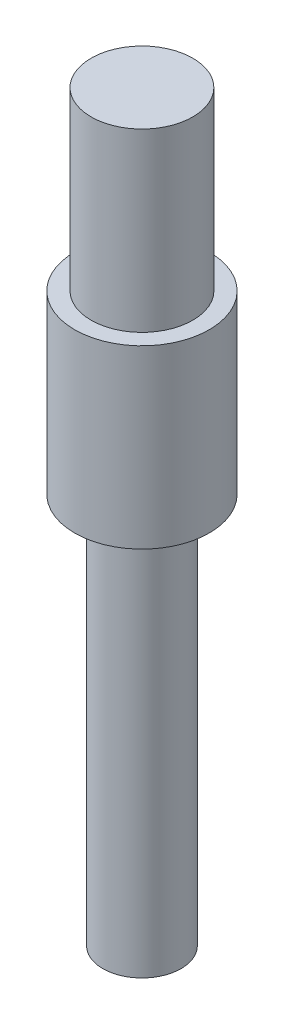
ISO-10303-21;
HEADER;
FILE_DESCRIPTION(('STEP AP214'),'2;1');
FILE_NAME('part.step','',(''),(''),'','','');
FILE_SCHEMA(('AUTOMOTIVE_DESIGN { 1 0 10303 214 1 1 1 1 }'));
ENDSEC;
DATA;
#1=APPLICATION_CONTEXT('core data for automotive mechanical design processes');
#2=APPLICATION_PROTOCOL_DEFINITION('international standard','automotive_design',2000,#1);
#3=PRODUCT_CONTEXT('',#1,'mechanical');
#4=PRODUCT('Part','Part','',(#3));
#5=PRODUCT_RELATED_PRODUCT_CATEGORY('part','',(#4));
#6=PRODUCT_DEFINITION_FORMATION('','',#4);
#7=PRODUCT_DEFINITION_CONTEXT('part definition',#1,'design');
#8=PRODUCT_DEFINITION('design','',#6,#7);
#9=PRODUCT_DEFINITION_SHAPE('','',#8);
#10=(LENGTH_UNIT() NAMED_UNIT(*) SI_UNIT(.MILLI.,.METRE.));
#11=(NAMED_UNIT(*) PLANE_ANGLE_UNIT() SI_UNIT($,.RADIAN.));
#12=(NAMED_UNIT(*) SI_UNIT($,.STERADIAN.) SOLID_ANGLE_UNIT());
#13=UNCERTAINTY_MEASURE_WITH_UNIT(LENGTH_MEASURE(1.E-05),#10,'distance_accuracy_value','');
#14=(GEOMETRIC_REPRESENTATION_CONTEXT(3) GLOBAL_UNCERTAINTY_ASSIGNED_CONTEXT((#13)) GLOBAL_UNIT_ASSIGNED_CONTEXT((#10,
#11,#12)) REPRESENTATION_CONTEXT('',''));
#15=CARTESIAN_POINT('',(0.,0.,0.));
#16=DIRECTION('',(0.,0.,1.));
#17=DIRECTION('',(1.,0.,0.));
#18=AXIS2_PLACEMENT_3D('',#15,#16,#17);
#19=CARTESIAN_POINT('',(0.,63.5,0.));
#20=DIRECTION('',(0.,-1.,0.));
#21=DIRECTION('',(0.,0.,-1.));
#22=AXIS2_PLACEMENT_3D('',#19,#20,#21);
#23=CYLINDRICAL_SURFACE('',#22,6.35);
#24=CARTESIAN_POINT('',(0.,63.5,0.));
#25=DIRECTION('',(0.,1.,0.));
#26=DIRECTION('',(0.,0.,1.));
#27=AXIS2_PLACEMENT_3D('',#24,#25,#26);
#28=CIRCLE('',#27,6.35);
#29=CARTESIAN_POINT('',(0.,63.5,6.35));
#30=VERTEX_POINT('',#29);
#31=EDGE_CURVE('E42',#30,#30,#28,.T.);
#32=ORIENTED_EDGE('',*,*,#31,.F.);
#33=EDGE_LOOP('',(#32));
#34=FACE_BOUND('',#33,.T.);
#35=CARTESIAN_POINT('',(0.,0.,0.));
#36=DIRECTION('',(0.,1.,0.));
#37=DIRECTION('',(0.,0.,1.));
#38=AXIS2_PLACEMENT_3D('',#35,#36,#37);
#39=CIRCLE('',#38,6.35);
#40=CARTESIAN_POINT('',(0.,0.,6.35));
#41=VERTEX_POINT('',#40);
#42=EDGE_CURVE('E38',#41,#41,#39,.T.);
#43=ORIENTED_EDGE('',*,*,#42,.T.);
#44=EDGE_LOOP('',(#43));
#45=FACE_BOUND('',#44,.T.);
#46=ADVANCED_FACE('F35',(#34,#45),#23,.T.);
#47=CARTESIAN_POINT('',(0.,0.,0.));
#48=DIRECTION('',(0.,1.,0.));
#49=DIRECTION('',(0.,0.,1.));
#50=AXIS2_PLACEMENT_3D('',#47,#48,#49);
#51=PLANE('',#50);
#52=ORIENTED_EDGE('',*,*,#42,.F.);
#53=EDGE_LOOP('',(#52));
#54=FACE_BOUND('',#53,.T.);
#55=ADVANCED_FACE('F76',(#54),#51,.F.);
#56=CARTESIAN_POINT('',(0.,92.075,0.));
#57=DIRECTION('',(0.,-1.,0.));
#58=DIRECTION('',(0.,0.,-1.));
#59=AXIS2_PLACEMENT_3D('',#56,#57,#58);
#60=CYLINDRICAL_SURFACE('',#59,10.922);
#61=CARTESIAN_POINT('',(0.,92.075,0.));
#62=DIRECTION('',(0.,1.,0.));
#63=DIRECTION('',(0.,0.,1.));
#64=AXIS2_PLACEMENT_3D('',#61,#62,#63);
#65=CIRCLE('',#64,10.922);
#66=CARTESIAN_POINT('',(0.,92.075,10.922));
#67=VERTEX_POINT('',#66);
#68=EDGE_CURVE('E50',#67,#67,#65,.T.);
#69=ORIENTED_EDGE('',*,*,#68,.F.);
#70=EDGE_LOOP('',(#69));
#71=FACE_BOUND('',#70,.T.);
#72=CARTESIAN_POINT('',(0.,63.5,0.));
#73=DIRECTION('',(0.,1.,0.));
#74=DIRECTION('',(0.,0.,1.));
#75=AXIS2_PLACEMENT_3D('',#72,#73,#74);
#76=CIRCLE('',#75,10.922);
#77=CARTESIAN_POINT('',(0.,63.5,10.922));
#78=VERTEX_POINT('',#77);
#79=EDGE_CURVE('E53',#78,#78,#76,.T.);
#80=ORIENTED_EDGE('',*,*,#79,.T.);
#81=EDGE_LOOP('',(#80));
#82=FACE_BOUND('',#81,.T.);
#83=ADVANCED_FACE('F81',(#71,#82),#60,.T.);
#84=CARTESIAN_POINT('',(0.,92.075,0.));
#85=DIRECTION('',(0.,1.,0.));
#86=DIRECTION('',(0.,0.,1.));
#87=AXIS2_PLACEMENT_3D('',#84,#85,#86);
#88=PLANE('',#87);
#89=CARTESIAN_POINT('',(0.,92.075,0.));
#90=DIRECTION('',(0.,1.,0.));
#91=DIRECTION('',(0.,0.,1.));
#92=AXIS2_PLACEMENT_3D('',#89,#90,#91);
#93=CIRCLE('',#92,8.255);
#94=CARTESIAN_POINT('',(0.,92.075,8.255));
#95=VERTEX_POINT('',#94);
#96=EDGE_CURVE('E10',#95,#95,#93,.T.);
#97=ORIENTED_EDGE('',*,*,#96,.F.);
#98=EDGE_LOOP('',(#97));
#99=FACE_BOUND('',#98,.T.);
#100=ORIENTED_EDGE('',*,*,#68,.T.);
#101=EDGE_LOOP('',(#100));
#102=FACE_BOUND('',#101,.T.);
#103=ADVANCED_FACE('F71',(#99,#102),#88,.T.);
#104=CARTESIAN_POINT('',(0.,63.5,0.));
#105=DIRECTION('',(0.,1.,0.));
#106=DIRECTION('',(0.,0.,1.));
#107=AXIS2_PLACEMENT_3D('',#104,#105,#106);
#108=PLANE('',#107);
#109=ORIENTED_EDGE('',*,*,#31,.T.);
#110=EDGE_LOOP('',(#109));
#111=FACE_BOUND('',#110,.T.);
#112=ORIENTED_EDGE('',*,*,#79,.F.);
#113=EDGE_LOOP('',(#112));
#114=FACE_BOUND('',#113,.T.);
#115=ADVANCED_FACE('F64',(#111,#114),#108,.F.);
#116=CARTESIAN_POINT('',(0.,120.65,0.));
#117=DIRECTION('',(0.,-1.,0.));
#118=DIRECTION('',(0.,0.,-1.));
#119=AXIS2_PLACEMENT_3D('',#116,#117,#118);
#120=CYLINDRICAL_SURFACE('',#119,8.255);
#121=CARTESIAN_POINT('',(0.,120.65,0.));
#122=DIRECTION('',(0.,1.,0.));
#123=DIRECTION('',(0.,0.,1.));
#124=AXIS2_PLACEMENT_3D('',#121,#122,#123);
#125=CIRCLE('',#124,8.255);
#126=CARTESIAN_POINT('',(0.,120.65,8.255));
#127=VERTEX_POINT('',#126);
#128=EDGE_CURVE('E49',#127,#127,#125,.T.);
#129=ORIENTED_EDGE('',*,*,#128,.F.);
#130=EDGE_LOOP('',(#129));
#131=FACE_BOUND('',#130,.T.);
#132=ORIENTED_EDGE('',*,*,#96,.T.);
#133=EDGE_LOOP('',(#132));
#134=FACE_BOUND('',#133,.T.);
#135=ADVANCED_FACE('F62',(#131,#134),#120,.T.);
#136=CARTESIAN_POINT('',(0.,120.65,0.));
#137=DIRECTION('',(0.,1.,0.));
#138=DIRECTION('',(0.,0.,1.));
#139=AXIS2_PLACEMENT_3D('',#136,#137,#138);
#140=PLANE('',#139);
#141=ORIENTED_EDGE('',*,*,#128,.T.);
#142=EDGE_LOOP('',(#141));
#143=FACE_BOUND('',#142,.T.);
#144=ADVANCED_FACE('F60',(#143),#140,.T.);
#145=CLOSED_SHELL('',(#46,#55,#83,#103,#115,#135,#144));
#146=MANIFOLD_SOLID_BREP('B2',#145);
#147=ADVANCED_BREP_SHAPE_REPRESENTATION('',(#18,#146),#14);
#148=SHAPE_DEFINITION_REPRESENTATION(#9,#147);
ENDSEC;
END-ISO-10303-21;
